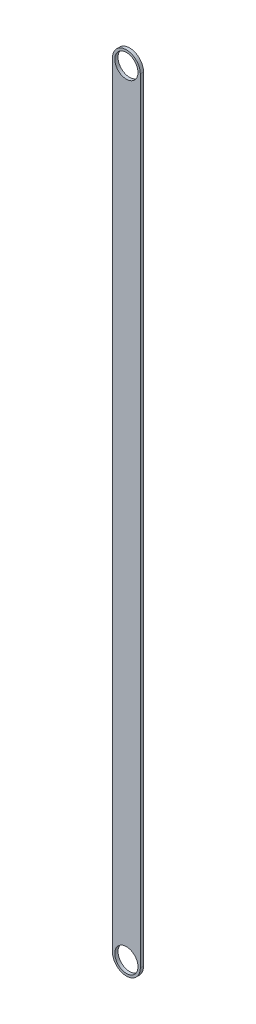
ISO-10303-21;
HEADER;
FILE_DESCRIPTION(('STEP AP214'),'2;1');
FILE_NAME('part.step','',(''),(''),'','','');
FILE_SCHEMA(('AUTOMOTIVE_DESIGN { 1 0 10303 214 1 1 1 1 }'));
ENDSEC;
DATA;
#1=APPLICATION_CONTEXT('core data for automotive mechanical design processes');
#2=APPLICATION_PROTOCOL_DEFINITION('international standard','automotive_design',2000,#1);
#3=PRODUCT_CONTEXT('',#1,'mechanical');
#4=PRODUCT('Part','Part','',(#3));
#5=PRODUCT_RELATED_PRODUCT_CATEGORY('part','',(#4));
#6=PRODUCT_DEFINITION_FORMATION('','',#4);
#7=PRODUCT_DEFINITION_CONTEXT('part definition',#1,'design');
#8=PRODUCT_DEFINITION('design','',#6,#7);
#9=PRODUCT_DEFINITION_SHAPE('','',#8);
#10=(LENGTH_UNIT() NAMED_UNIT(*) SI_UNIT(.MILLI.,.METRE.));
#11=(NAMED_UNIT(*) PLANE_ANGLE_UNIT() SI_UNIT($,.RADIAN.));
#12=(NAMED_UNIT(*) SI_UNIT($,.STERADIAN.) SOLID_ANGLE_UNIT());
#13=UNCERTAINTY_MEASURE_WITH_UNIT(LENGTH_MEASURE(1.E-05),#10,'distance_accuracy_value','');
#14=(GEOMETRIC_REPRESENTATION_CONTEXT(3) GLOBAL_UNCERTAINTY_ASSIGNED_CONTEXT((#13)) GLOBAL_UNIT_ASSIGNED_CONTEXT((#10,
#11,#12)) REPRESENTATION_CONTEXT('',''));
#15=CARTESIAN_POINT('',(0.,0.,0.));
#16=DIRECTION('',(0.,0.,1.));
#17=DIRECTION('',(1.,0.,0.));
#18=AXIS2_PLACEMENT_3D('',#15,#16,#17);
#19=CARTESIAN_POINT('',(98.85,-122.8,-0.045));
#20=DIRECTION('',(0.,0.,-1.));
#21=DIRECTION('',(0.,-1.,0.));
#22=AXIS2_PLACEMENT_3D('',#19,#20,#21);
#23=CYLINDRICAL_SURFACE('',#22,0.125);
#24=CARTESIAN_POINT('',(98.85,-122.8,-0.035));
#25=DIRECTION('',(0.,0.,-1.));
#26=DIRECTION('',(0.,-1.,0.));
#27=AXIS2_PLACEMENT_3D('',#24,#25,#26);
#28=CIRCLE('',#27,0.125);
#29=CARTESIAN_POINT('',(98.85,-122.925,-0.035));
#30=VERTEX_POINT('',#29);
#31=EDGE_CURVE('E131',#30,#30,#28,.T.);
#32=ORIENTED_EDGE('',*,*,#31,.T.);
#33=DIRECTION('',(0.,0.,1.));
#34=VECTOR('',#33,1.);
#35=CARTESIAN_POINT('',(98.85,-122.925,-0.045));
#36=LINE('',#35,#34);
#37=CARTESIAN_POINT('',(98.85,-122.925,0.));
#38=VERTEX_POINT('',#37);
#39=EDGE_CURVE('E11',#30,#38,#36,.T.);
#40=ORIENTED_EDGE('',*,*,#39,.T.);
#41=CARTESIAN_POINT('',(98.85,-122.8,0.));
#42=DIRECTION('',(0.,0.,-1.));
#43=DIRECTION('',(0.,-1.,0.));
#44=AXIS2_PLACEMENT_3D('',#41,#42,#43);
#45=CIRCLE('',#44,0.125);
#46=EDGE_CURVE('E137',#38,#38,#45,.T.);
#47=ORIENTED_EDGE('',*,*,#46,.F.);
#48=ORIENTED_EDGE('',*,*,#39,.F.);
#49=EDGE_LOOP('',(#32,#40,#47,#48));
#50=FACE_BOUND('',#49,.T.);
#51=ADVANCED_FACE('F17',(#50),#23,.F.);
#52=CARTESIAN_POINT('',(98.85,-131.15,-0.045));
#53=DIRECTION('',(0.,0.,-1.));
#54=DIRECTION('',(0.,-1.,0.));
#55=AXIS2_PLACEMENT_3D('',#52,#53,#54);
#56=CYLINDRICAL_SURFACE('',#55,0.125);
#57=CARTESIAN_POINT('',(98.85,-131.15,-0.035));
#58=DIRECTION('',(0.,0.,-1.));
#59=DIRECTION('',(0.,-1.,0.));
#60=AXIS2_PLACEMENT_3D('',#57,#58,#59);
#61=CIRCLE('',#60,0.125);
#62=CARTESIAN_POINT('',(98.85,-131.275,-0.035));
#63=VERTEX_POINT('',#62);
#64=EDGE_CURVE('E148',#63,#63,#61,.T.);
#65=ORIENTED_EDGE('',*,*,#64,.T.);
#66=DIRECTION('',(0.,0.,1.));
#67=VECTOR('',#66,1.);
#68=CARTESIAN_POINT('',(98.85,-131.275,-0.045));
#69=LINE('',#68,#67);
#70=CARTESIAN_POINT('',(98.85,-131.275,0.));
#71=VERTEX_POINT('',#70);
#72=EDGE_CURVE('E25',#63,#71,#69,.T.);
#73=ORIENTED_EDGE('',*,*,#72,.T.);
#74=CARTESIAN_POINT('',(98.85,-131.15,0.));
#75=DIRECTION('',(0.,0.,-1.));
#76=DIRECTION('',(0.,-1.,0.));
#77=AXIS2_PLACEMENT_3D('',#74,#75,#76);
#78=CIRCLE('',#77,0.125);
#79=EDGE_CURVE('E130',#71,#71,#78,.T.);
#80=ORIENTED_EDGE('',*,*,#79,.F.);
#81=ORIENTED_EDGE('',*,*,#72,.F.);
#82=EDGE_LOOP('',(#65,#73,#80,#81));
#83=FACE_BOUND('',#82,.T.);
#84=ADVANCED_FACE('F230',(#83),#56,.F.);
#85=CARTESIAN_POINT('',(99.,-131.15,-0.035));
#86=DIRECTION('',(-1.,0.,0.));
#87=DIRECTION('',(0.,0.,1.));
#88=AXIS2_PLACEMENT_3D('',#85,#86,#87);
#89=PLANE('',#88);
#90=DIRECTION('',(0.,1.,0.));
#91=VECTOR('',#90,1.);
#92=CARTESIAN_POINT('',(99.,-131.15,-0.035));
#93=LINE('',#92,#91);
#94=CARTESIAN_POINT('',(99.,-131.15,-0.035));
#95=VERTEX_POINT('',#94);
#96=CARTESIAN_POINT('',(99.,-122.8,-0.035));
#97=VERTEX_POINT('',#96);
#98=EDGE_CURVE('E145',#95,#97,#93,.T.);
#99=ORIENTED_EDGE('',*,*,#98,.T.);
#100=DIRECTION('',(0.,0.,1.));
#101=VECTOR('',#100,1.);
#102=CARTESIAN_POINT('',(99.,-122.8,-0.035));
#103=LINE('',#102,#101);
#104=CARTESIAN_POINT('',(99.,-122.8,0.));
#105=VERTEX_POINT('',#104);
#106=EDGE_CURVE('E95',#97,#105,#103,.T.);
#107=ORIENTED_EDGE('',*,*,#106,.T.);
#108=DIRECTION('',(0.,1.,0.));
#109=VECTOR('',#108,1.);
#110=CARTESIAN_POINT('',(99.,-131.15,0.));
#111=LINE('',#110,#109);
#112=CARTESIAN_POINT('',(99.,-131.15,0.));
#113=VERTEX_POINT('',#112);
#114=EDGE_CURVE('E128',#113,#105,#111,.T.);
#115=ORIENTED_EDGE('',*,*,#114,.F.);
#116=DIRECTION('',(0.,0.,1.));
#117=VECTOR('',#116,1.);
#118=CARTESIAN_POINT('',(99.,-131.15,-0.035));
#119=LINE('',#118,#117);
#120=EDGE_CURVE('E140',#95,#113,#119,.T.);
#121=ORIENTED_EDGE('',*,*,#120,.F.);
#122=EDGE_LOOP('',(#99,#107,#115,#121));
#123=FACE_BOUND('',#122,.T.);
#124=ADVANCED_FACE('F216',(#123),#89,.F.);
#125=CARTESIAN_POINT('',(98.7,-122.8,0.));
#126=DIRECTION('',(0.,0.,1.));
#127=DIRECTION('',(1.,0.,0.));
#128=AXIS2_PLACEMENT_3D('',#125,#126,#127);
#129=PLANE('',#128);
#130=ORIENTED_EDGE('',*,*,#46,.T.);
#131=EDGE_LOOP('',(#130));
#132=FACE_BOUND('',#131,.T.);
#133=ORIENTED_EDGE('',*,*,#79,.T.);
#134=EDGE_LOOP('',(#133));
#135=FACE_BOUND('',#134,.T.);
#136=DIRECTION('',(0.,-1.,0.));
#137=VECTOR('',#136,1.);
#138=CARTESIAN_POINT('',(98.7,-122.8,0.));
#139=LINE('',#138,#137);
#140=CARTESIAN_POINT('',(98.7,-122.8,0.));
#141=VERTEX_POINT('',#140);
#142=CARTESIAN_POINT('',(98.7,-131.15,0.));
#143=VERTEX_POINT('',#142);
#144=EDGE_CURVE('E107',#141,#143,#139,.T.);
#145=ORIENTED_EDGE('',*,*,#144,.T.);
#146=CARTESIAN_POINT('',(98.85,-131.15,0.));
#147=DIRECTION('',(0.,0.,1.));
#148=DIRECTION('',(-1.,1.894780628694E-13,0.));
#149=AXIS2_PLACEMENT_3D('',#146,#147,#148);
#150=CIRCLE('',#149,0.15);
#151=EDGE_CURVE('E141',#143,#113,#150,.T.);
#152=ORIENTED_EDGE('',*,*,#151,.T.);
#153=ORIENTED_EDGE('',*,*,#114,.T.);
#154=CARTESIAN_POINT('',(98.85,-122.8,0.));
#155=DIRECTION('',(0.,0.,1.));
#156=DIRECTION('',(1.,0.,0.));
#157=AXIS2_PLACEMENT_3D('',#154,#155,#156);
#158=CIRCLE('',#157,0.15);
#159=EDGE_CURVE('E99',#105,#141,#158,.T.);
#160=ORIENTED_EDGE('',*,*,#159,.T.);
#161=EDGE_LOOP('',(#145,#152,#153,#160));
#162=FACE_BOUND('',#161,.T.);
#163=ADVANCED_FACE('F218',(#132,#135,#162),#129,.T.);
#164=CARTESIAN_POINT('',(98.7,-122.8,-0.035));
#165=DIRECTION('',(0.,0.,1.));
#166=DIRECTION('',(1.,0.,0.));
#167=AXIS2_PLACEMENT_3D('',#164,#165,#166);
#168=PLANE('',#167);
#169=ORIENTED_EDGE('',*,*,#31,.F.);
#170=EDGE_LOOP('',(#169));
#171=FACE_BOUND('',#170,.T.);
#172=ORIENTED_EDGE('',*,*,#64,.F.);
#173=EDGE_LOOP('',(#172));
#174=FACE_BOUND('',#173,.T.);
#175=CARTESIAN_POINT('',(98.85,-122.8,-0.035));
#176=DIRECTION('',(0.,0.,1.));
#177=DIRECTION('',(1.,0.,0.));
#178=AXIS2_PLACEMENT_3D('',#175,#176,#177);
#179=CIRCLE('',#178,0.15);
#180=CARTESIAN_POINT('',(98.7,-122.8,-0.035));
#181=VERTEX_POINT('',#180);
#182=EDGE_CURVE('E88',#97,#181,#179,.T.);
#183=ORIENTED_EDGE('',*,*,#182,.F.);
#184=ORIENTED_EDGE('',*,*,#98,.F.);
#185=CARTESIAN_POINT('',(98.85,-131.15,-0.035));
#186=DIRECTION('',(0.,0.,1.));
#187=DIRECTION('',(-1.,1.894780628694E-13,0.));
#188=AXIS2_PLACEMENT_3D('',#185,#186,#187);
#189=CIRCLE('',#188,0.15);
#190=CARTESIAN_POINT('',(98.7,-131.15,-0.035));
#191=VERTEX_POINT('',#190);
#192=EDGE_CURVE('E112',#191,#95,#189,.T.);
#193=ORIENTED_EDGE('',*,*,#192,.F.);
#194=DIRECTION('',(0.,-1.,0.));
#195=VECTOR('',#194,1.);
#196=CARTESIAN_POINT('',(98.7,-122.8,-0.035));
#197=LINE('',#196,#195);
#198=EDGE_CURVE('E105',#181,#191,#197,.T.);
#199=ORIENTED_EDGE('',*,*,#198,.F.);
#200=EDGE_LOOP('',(#183,#184,#193,#199));
#201=FACE_BOUND('',#200,.T.);
#202=ADVANCED_FACE('F110',(#171,#174,#201),#168,.F.);
#203=CARTESIAN_POINT('',(98.85,-131.15,-0.035));
#204=DIRECTION('',(0.,0.,-1.));
#205=DIRECTION('',(-1.,1.894780628694E-13,0.));
#206=AXIS2_PLACEMENT_3D('',#203,#204,#205);
#207=CYLINDRICAL_SURFACE('',#206,0.15);
#208=ORIENTED_EDGE('',*,*,#192,.T.);
#209=ORIENTED_EDGE('',*,*,#120,.T.);
#210=ORIENTED_EDGE('',*,*,#151,.F.);
#211=DIRECTION('',(0.,0.,1.));
#212=VECTOR('',#211,1.);
#213=CARTESIAN_POINT('',(98.7,-131.15,-0.035));
#214=LINE('',#213,#212);
#215=EDGE_CURVE('E115',#191,#143,#214,.T.);
#216=ORIENTED_EDGE('',*,*,#215,.F.);
#217=EDGE_LOOP('',(#208,#209,#210,#216));
#218=FACE_BOUND('',#217,.T.);
#219=ADVANCED_FACE('F214',(#218),#207,.T.);
#220=CARTESIAN_POINT('',(98.85,-122.8,-0.035));
#221=DIRECTION('',(0.,0.,-1.));
#222=DIRECTION('',(1.,0.,0.));
#223=AXIS2_PLACEMENT_3D('',#220,#221,#222);
#224=CYLINDRICAL_SURFACE('',#223,0.15);
#225=ORIENTED_EDGE('',*,*,#182,.T.);
#226=DIRECTION('',(0.,0.,1.));
#227=VECTOR('',#226,1.);
#228=CARTESIAN_POINT('',(98.7,-122.8,-0.035));
#229=LINE('',#228,#227);
#230=EDGE_CURVE('E92',#181,#141,#229,.T.);
#231=ORIENTED_EDGE('',*,*,#230,.T.);
#232=ORIENTED_EDGE('',*,*,#159,.F.);
#233=ORIENTED_EDGE('',*,*,#106,.F.);
#234=EDGE_LOOP('',(#225,#231,#232,#233));
#235=FACE_BOUND('',#234,.T.);
#236=ADVANCED_FACE('F90',(#235),#224,.T.);
#237=CARTESIAN_POINT('',(98.7,-122.8,-0.035));
#238=DIRECTION('',(1.,0.,0.));
#239=DIRECTION('',(0.,1.,0.));
#240=AXIS2_PLACEMENT_3D('',#237,#238,#239);
#241=PLANE('',#240);
#242=ORIENTED_EDGE('',*,*,#198,.T.);
#243=ORIENTED_EDGE('',*,*,#215,.T.);
#244=ORIENTED_EDGE('',*,*,#144,.F.);
#245=ORIENTED_EDGE('',*,*,#230,.F.);
#246=EDGE_LOOP('',(#242,#243,#244,#245));
#247=FACE_BOUND('',#246,.T.);
#248=ADVANCED_FACE('F103',(#247),#241,.F.);
#249=CLOSED_SHELL('',(#51,#84,#124,#163,#202,#219,#236,#248));
#250=MANIFOLD_SOLID_BREP('B1',#249);
#251=ADVANCED_BREP_SHAPE_REPRESENTATION('',(#18,#250),#14);
#252=SHAPE_DEFINITION_REPRESENTATION(#9,#251);
ENDSEC;
END-ISO-10303-21;
